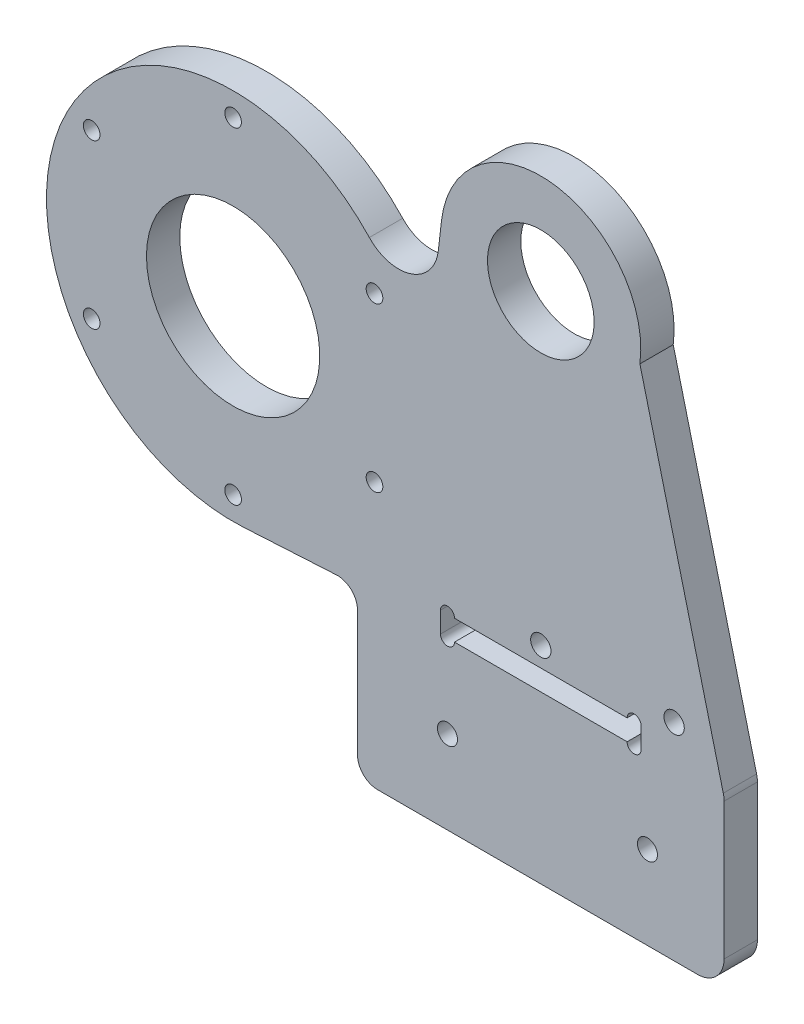
ISO-10303-21;
HEADER;
FILE_DESCRIPTION(('STEP AP214'),'2;1');
FILE_NAME('part.step','',(''),(''),'','','');
FILE_SCHEMA(('AUTOMOTIVE_DESIGN { 1 0 10303 214 1 1 1 1 }'));
ENDSEC;
DATA;
#1=APPLICATION_CONTEXT('core data for automotive mechanical design processes');
#2=APPLICATION_PROTOCOL_DEFINITION('international standard','automotive_design',2000,#1);
#3=PRODUCT_CONTEXT('',#1,'mechanical');
#4=PRODUCT('Part','Part','',(#3));
#5=PRODUCT_RELATED_PRODUCT_CATEGORY('part','',(#4));
#6=PRODUCT_DEFINITION_FORMATION('','',#4);
#7=PRODUCT_DEFINITION_CONTEXT('part definition',#1,'design');
#8=PRODUCT_DEFINITION('design','',#6,#7);
#9=PRODUCT_DEFINITION_SHAPE('','',#8);
#10=(LENGTH_UNIT() NAMED_UNIT(*) SI_UNIT(.MILLI.,.METRE.));
#11=(NAMED_UNIT(*) PLANE_ANGLE_UNIT() SI_UNIT($,.RADIAN.));
#12=(NAMED_UNIT(*) SI_UNIT($,.STERADIAN.) SOLID_ANGLE_UNIT());
#13=UNCERTAINTY_MEASURE_WITH_UNIT(LENGTH_MEASURE(1.E-05),#10,'distance_accuracy_value','');
#14=(GEOMETRIC_REPRESENTATION_CONTEXT(3) GLOBAL_UNCERTAINTY_ASSIGNED_CONTEXT((#13)) GLOBAL_UNIT_ASSIGNED_CONTEXT((#10,
#11,#12)) REPRESENTATION_CONTEXT('',''));
#15=CARTESIAN_POINT('',(0.,0.,0.));
#16=DIRECTION('',(0.,0.,1.));
#17=DIRECTION('',(1.,0.,0.));
#18=AXIS2_PLACEMENT_3D('',#15,#16,#17);
#19=CARTESIAN_POINT('',(-20.,-12.5,5.));
#20=DIRECTION('',(1.,0.,0.));
#21=DIRECTION('',(0.,1.,0.));
#22=AXIS2_PLACEMENT_3D('',#19,#20,#21);
#23=PLANE('',#22);
#24=DIRECTION('',(0.,-1.,0.));
#25=VECTOR('',#24,1.);
#26=CARTESIAN_POINT('',(-20.,-12.5,0.));
#27=LINE('',#26,#25);
#28=CARTESIAN_POINT('',(-20.,9.32755831972879,0.));
#29=VERTEX_POINT('',#28);
#30=CARTESIAN_POINT('',(-20.,-9.5,0.));
#31=VERTEX_POINT('',#30);
#32=EDGE_CURVE('E327',#29,#31,#27,.T.);
#33=ORIENTED_EDGE('',*,*,#32,.T.);
#34=DIRECTION('',(0.,0.,-1.));
#35=VECTOR('',#34,1.);
#36=CARTESIAN_POINT('',(-20.,-9.5,5.));
#37=LINE('',#36,#35);
#38=CARTESIAN_POINT('',(-20.,-9.5,5.));
#39=VERTEX_POINT('',#38);
#40=EDGE_CURVE('E347',#31,#39,#37,.F.);
#41=ORIENTED_EDGE('',*,*,#40,.T.);
#42=DIRECTION('',(0.,-1.,0.));
#43=VECTOR('',#42,1.);
#44=CARTESIAN_POINT('',(-20.,-12.5,5.));
#45=LINE('',#44,#43);
#46=CARTESIAN_POINT('',(-20.,9.32755831972879,5.));
#47=VERTEX_POINT('',#46);
#48=EDGE_CURVE('E328',#47,#39,#45,.T.);
#49=ORIENTED_EDGE('',*,*,#48,.F.);
#50=DIRECTION('',(0.,0.,-1.));
#51=VECTOR('',#50,1.);
#52=CARTESIAN_POINT('',(-20.,9.32755831972879,5.));
#53=LINE('',#52,#51);
#54=EDGE_CURVE('E344',#47,#29,#53,.T.);
#55=ORIENTED_EDGE('',*,*,#54,.T.);
#56=EDGE_LOOP('',(#33,#41,#49,#55));
#57=FACE_BOUND('',#56,.T.);
#58=ADVANCED_FACE('F36',(#57),#23,.F.);
#59=CARTESIAN_POINT('',(-20.,-12.5,5.));
#60=DIRECTION('',(0.,1.,0.));
#61=DIRECTION('',(0.,0.,1.));
#62=AXIS2_PLACEMENT_3D('',#59,#60,#61);
#63=PLANE('',#62);
#64=DIRECTION('',(1.,0.,0.));
#65=VECTOR('',#64,1.);
#66=CARTESIAN_POINT('',(-20.,-12.5,0.));
#67=LINE('',#66,#65);
#68=CARTESIAN_POINT('',(-17.,-12.5,0.));
#69=VERTEX_POINT('',#68);
#70=CARTESIAN_POINT('',(31.,-12.5,0.));
#71=VERTEX_POINT('',#70);
#72=EDGE_CURVE('E332',#69,#71,#67,.T.);
#73=ORIENTED_EDGE('',*,*,#72,.T.);
#74=DIRECTION('',(0.,0.,-1.));
#75=VECTOR('',#74,1.);
#76=CARTESIAN_POINT('',(31.,-12.5,5.));
#77=LINE('',#76,#75);
#78=CARTESIAN_POINT('',(31.,-12.5,5.));
#79=VERTEX_POINT('',#78);
#80=EDGE_CURVE('E373',#71,#79,#77,.F.);
#81=ORIENTED_EDGE('',*,*,#80,.T.);
#82=DIRECTION('',(1.,0.,0.));
#83=VECTOR('',#82,1.);
#84=CARTESIAN_POINT('',(-20.,-12.5,5.));
#85=LINE('',#84,#83);
#86=CARTESIAN_POINT('',(-17.,-12.5,5.));
#87=VERTEX_POINT('',#86);
#88=EDGE_CURVE('E331',#87,#79,#85,.T.);
#89=ORIENTED_EDGE('',*,*,#88,.F.);
#90=DIRECTION('',(0.,0.,-1.));
#91=VECTOR('',#90,1.);
#92=CARTESIAN_POINT('',(-17.,-12.5,5.));
#93=LINE('',#92,#91);
#94=EDGE_CURVE('E335',#87,#69,#93,.T.);
#95=ORIENTED_EDGE('',*,*,#94,.T.);
#96=EDGE_LOOP('',(#73,#81,#89,#95));
#97=FACE_BOUND('',#96,.T.);
#98=ADVANCED_FACE('F406',(#97),#63,.F.);
#99=CARTESIAN_POINT('',(0.,0.,5.));
#100=DIRECTION('',(0.,0.,-1.));
#101=DIRECTION('',(-1.,0.,0.));
#102=AXIS2_PLACEMENT_3D('',#99,#100,#101);
#103=PLANE('',#102);
#104=CARTESIAN_POINT('',(27.5,18.5,5.));
#105=DIRECTION('',(0.,0.,-1.));
#106=DIRECTION('',(-1.,0.,0.));
#107=AXIS2_PLACEMENT_3D('',#104,#105,#106);
#108=CIRCLE('',#107,1.525);
#109=CARTESIAN_POINT('',(25.975,18.5,5.));
#110=VERTEX_POINT('',#109);
#111=EDGE_CURVE('E563',#110,#110,#108,.T.);
#112=ORIENTED_EDGE('',*,*,#111,.T.);
#113=EDGE_LOOP('',(#112));
#114=FACE_BOUND('',#113,.T.);
#115=CARTESIAN_POINT('',(7.49999999999995,18.5,5.));
#116=DIRECTION('',(0.,0.,-1.));
#117=DIRECTION('',(-1.,0.,0.));
#118=AXIS2_PLACEMENT_3D('',#115,#116,#117);
#119=CIRCLE('',#118,1.525);
#120=CARTESIAN_POINT('',(5.97499999999995,18.5,5.));
#121=VERTEX_POINT('',#120);
#122=EDGE_CURVE('E567',#121,#121,#119,.T.);
#123=ORIENTED_EDGE('',*,*,#122,.T.);
#124=EDGE_LOOP('',(#123));
#125=FACE_BOUND('',#124,.T.);
#126=CARTESIAN_POINT('',(23.5,0.,5.));
#127=DIRECTION('',(0.,0.,-1.));
#128=DIRECTION('',(-1.,0.,0.));
#129=AXIS2_PLACEMENT_3D('',#126,#127,#128);
#130=CIRCLE('',#129,1.5);
#131=CARTESIAN_POINT('',(22.,0.,5.));
#132=VERTEX_POINT('',#131);
#133=EDGE_CURVE('E554',#132,#132,#130,.T.);
#134=ORIENTED_EDGE('',*,*,#133,.T.);
#135=EDGE_LOOP('',(#134));
#136=FACE_BOUND('',#135,.T.);
#137=CARTESIAN_POINT('',(-6.50000000000005,0.,5.));
#138=DIRECTION('',(0.,0.,-1.));
#139=DIRECTION('',(-1.,0.,0.));
#140=AXIS2_PLACEMENT_3D('',#137,#138,#139);
#141=CIRCLE('',#140,1.5);
#142=CARTESIAN_POINT('',(-8.00000000000005,0.,5.));
#143=VERTEX_POINT('',#142);
#144=EDGE_CURVE('E557',#143,#143,#141,.T.);
#145=ORIENTED_EDGE('',*,*,#144,.T.);
#146=EDGE_LOOP('',(#145));
#147=FACE_BOUND('',#146,.T.);
#148=DIRECTION('',(-1.,0.,0.));
#149=VECTOR('',#148,1.);
#150=CARTESIAN_POINT('',(22.55,15.5500000000003,5.));
#151=LINE('',#150,#149);
#152=CARTESIAN_POINT('',(20.45,15.5500000000003,5.));
#153=VERTEX_POINT('',#152);
#154=CARTESIAN_POINT('',(-5.45000000000005,15.5500000000003,5.));
#155=VERTEX_POINT('',#154);
#156=EDGE_CURVE('E193',#153,#155,#151,.T.);
#157=ORIENTED_EDGE('',*,*,#156,.F.);
#158=CARTESIAN_POINT('',(21.5,15.5500000000003,5.));
#159=DIRECTION('',(0.,0.,1.));
#160=DIRECTION('',(1.,0.,0.));
#161=AXIS2_PLACEMENT_3D('',#158,#159,#160);
#162=CIRCLE('',#161,1.04999999999999);
#163=CARTESIAN_POINT('',(22.5499999999999,15.5500000000003,5.));
#164=VERTEX_POINT('',#163);
#165=EDGE_CURVE('E533',#164,#153,#162,.T.);
#166=ORIENTED_EDGE('',*,*,#165,.F.);
#167=DIRECTION('',(0.,1.,0.));
#168=VECTOR('',#167,1.);
#169=CARTESIAN_POINT('',(22.55,12.4500000000003,5.));
#170=LINE('',#169,#168);
#171=CARTESIAN_POINT('',(22.55,12.4500000000003,5.));
#172=VERTEX_POINT('',#171);
#173=EDGE_CURVE('E201',#172,#164,#170,.T.);
#174=ORIENTED_EDGE('',*,*,#173,.F.);
#175=CARTESIAN_POINT('',(21.5,12.4500000000003,5.));
#176=DIRECTION('',(0.,0.,1.));
#177=DIRECTION('',(1.,0.,0.));
#178=AXIS2_PLACEMENT_3D('',#175,#176,#177);
#179=CIRCLE('',#178,1.05);
#180=CARTESIAN_POINT('',(20.45,12.4500000000003,5.));
#181=VERTEX_POINT('',#180);
#182=EDGE_CURVE('E553',#181,#172,#179,.T.);
#183=ORIENTED_EDGE('',*,*,#182,.F.);
#184=DIRECTION('',(1.,0.,0.));
#185=VECTOR('',#184,1.);
#186=CARTESIAN_POINT('',(-7.55000000000005,12.4500000000003,5.));
#187=LINE('',#186,#185);
#188=CARTESIAN_POINT('',(-5.45000000000005,12.4500000000003,5.));
#189=VERTEX_POINT('',#188);
#190=EDGE_CURVE('E207',#189,#181,#187,.T.);
#191=ORIENTED_EDGE('',*,*,#190,.F.);
#192=CARTESIAN_POINT('',(-6.50000000000005,12.4500000000003,5.));
#193=DIRECTION('',(0.,0.,1.));
#194=DIRECTION('',(1.,0.,0.));
#195=AXIS2_PLACEMENT_3D('',#192,#193,#194);
#196=CIRCLE('',#195,1.05);
#197=CARTESIAN_POINT('',(-7.55000000000004,12.4500000000003,5.));
#198=VERTEX_POINT('',#197);
#199=EDGE_CURVE('E538',#198,#189,#196,.T.);
#200=ORIENTED_EDGE('',*,*,#199,.F.);
#201=DIRECTION('',(0.,-1.,0.));
#202=VECTOR('',#201,1.);
#203=CARTESIAN_POINT('',(-7.55000000000005,15.5500000000003,5.));
#204=LINE('',#203,#202);
#205=CARTESIAN_POINT('',(-7.55000000000005,15.5500000000003,5.));
#206=VERTEX_POINT('',#205);
#207=EDGE_CURVE('E196',#206,#198,#204,.T.);
#208=ORIENTED_EDGE('',*,*,#207,.F.);
#209=CARTESIAN_POINT('',(-6.50000000000005,15.5500000000003,5.));
#210=DIRECTION('',(0.,0.,1.));
#211=DIRECTION('',(1.,0.,0.));
#212=AXIS2_PLACEMENT_3D('',#209,#210,#211);
#213=CIRCLE('',#212,1.05);
#214=EDGE_CURVE('E51',#155,#206,#213,.T.);
#215=ORIENTED_EDGE('',*,*,#214,.F.);
#216=EDGE_LOOP('',(#157,#166,#174,#183,#191,#200,#208,#215));
#217=FACE_BOUND('',#216,.T.);
#218=CARTESIAN_POINT('',(-38.6654632815485,39.5,5.));
#219=DIRECTION('',(0.,0.,-1.));
#220=DIRECTION('',(-1.,0.,0.));
#221=AXIS2_PLACEMENT_3D('',#218,#219,#220);
#222=CIRCLE('',#221,13.);
#223=CARTESIAN_POINT('',(-51.6654632815485,39.5,5.));
#224=VERTEX_POINT('',#223);
#225=EDGE_CURVE('E270',#224,#224,#222,.T.);
#226=ORIENTED_EDGE('',*,*,#225,.T.);
#227=EDGE_LOOP('',(#226));
#228=FACE_BOUND('',#227,.T.);
#229=CARTESIAN_POINT('',(-38.6654632815485,64.,5.));
#230=DIRECTION('',(0.,0.,-1.));
#231=DIRECTION('',(-1.,0.,0.));
#232=AXIS2_PLACEMENT_3D('',#229,#230,#231);
#233=CIRCLE('',#232,1.25);
#234=CARTESIAN_POINT('',(-39.9154632815485,64.,5.));
#235=VERTEX_POINT('',#234);
#236=EDGE_CURVE('E306',#235,#235,#233,.T.);
#237=ORIENTED_EDGE('',*,*,#236,.T.);
#238=EDGE_LOOP('',(#237));
#239=FACE_BOUND('',#238,.T.);
#240=CARTESIAN_POINT('',(-17.4478408888297,51.75,5.));
#241=DIRECTION('',(0.,0.,-1.));
#242=DIRECTION('',(-1.,0.,0.));
#243=AXIS2_PLACEMENT_3D('',#240,#241,#242);
#244=CIRCLE('',#243,1.25);
#245=CARTESIAN_POINT('',(-18.6978408888297,51.75,5.));
#246=VERTEX_POINT('',#245);
#247=EDGE_CURVE('E303',#246,#246,#244,.T.);
#248=ORIENTED_EDGE('',*,*,#247,.T.);
#249=EDGE_LOOP('',(#248));
#250=FACE_BOUND('',#249,.T.);
#251=CARTESIAN_POINT('',(-17.4478408888297,27.25,5.));
#252=DIRECTION('',(0.,0.,-1.));
#253=DIRECTION('',(-1.,0.,0.));
#254=AXIS2_PLACEMENT_3D('',#251,#252,#253);
#255=CIRCLE('',#254,1.25);
#256=CARTESIAN_POINT('',(-18.6978408888297,27.25,5.));
#257=VERTEX_POINT('',#256);
#258=EDGE_CURVE('E300',#257,#257,#255,.T.);
#259=ORIENTED_EDGE('',*,*,#258,.T.);
#260=EDGE_LOOP('',(#259));
#261=FACE_BOUND('',#260,.T.);
#262=CARTESIAN_POINT('',(-38.6654632815485,15.,5.));
#263=DIRECTION('',(0.,0.,-1.));
#264=DIRECTION('',(-1.,0.,0.));
#265=AXIS2_PLACEMENT_3D('',#262,#263,#264);
#266=CIRCLE('',#265,1.25000000000001);
#267=CARTESIAN_POINT('',(-39.9154632815485,15.,5.));
#268=VERTEX_POINT('',#267);
#269=EDGE_CURVE('E297',#268,#268,#266,.T.);
#270=ORIENTED_EDGE('',*,*,#269,.T.);
#271=EDGE_LOOP('',(#270));
#272=FACE_BOUND('',#271,.T.);
#273=CARTESIAN_POINT('',(-59.8830856742672,27.25,5.));
#274=DIRECTION('',(0.,0.,-1.));
#275=DIRECTION('',(-1.,0.,0.));
#276=AXIS2_PLACEMENT_3D('',#273,#274,#275);
#277=CIRCLE('',#276,1.24999999999999);
#278=CARTESIAN_POINT('',(-61.1330856742672,27.25,5.));
#279=VERTEX_POINT('',#278);
#280=EDGE_CURVE('E294',#279,#279,#277,.T.);
#281=ORIENTED_EDGE('',*,*,#280,.T.);
#282=EDGE_LOOP('',(#281));
#283=FACE_BOUND('',#282,.T.);
#284=CARTESIAN_POINT('',(-59.8830856742672,51.75,5.));
#285=DIRECTION('',(0.,0.,-1.));
#286=DIRECTION('',(-1.,0.,0.));
#287=AXIS2_PLACEMENT_3D('',#284,#285,#286);
#288=CIRCLE('',#287,1.25);
#289=CARTESIAN_POINT('',(-61.1330856742672,51.75,5.));
#290=VERTEX_POINT('',#289);
#291=EDGE_CURVE('E277',#290,#290,#288,.T.);
#292=ORIENTED_EDGE('',*,*,#291,.T.);
#293=EDGE_LOOP('',(#292));
#294=FACE_BOUND('',#293,.T.);
#295=CARTESIAN_POINT('',(7.49999999999998,64.5,5.));
#296=DIRECTION('',(0.,0.,-1.));
#297=DIRECTION('',(-1.,0.,0.));
#298=AXIS2_PLACEMENT_3D('',#295,#296,#297);
#299=CIRCLE('',#298,15.);
#300=CARTESIAN_POINT('',(22.3667449619937,62.5050327734435,5.));
#301=VERTEX_POINT('',#300);
#302=CARTESIAN_POINT('',(-7.40138609631586,66.2171757069458,5.));
#303=VERTEX_POINT('',#302);
#304=EDGE_CURVE('E253',#301,#303,#299,.F.);
#305=ORIENTED_EDGE('',*,*,#304,.T.);
#306=DIRECTION('',(-0.114478380463056,-0.993425739754389,0.));
#307=VECTOR('',#306,1.);
#308=CARTESIAN_POINT('',(-14.8349879951987,1.70952425724252,5.));
#309=LINE('',#308,#307);
#310=CARTESIAN_POINT('',(-7.8819237710066,62.0471438369233,5.));
#311=VERTEX_POINT('',#310);
#312=EDGE_CURVE('E241',#303,#311,#309,.T.);
#313=ORIENTED_EDGE('',*,*,#312,.T.);
#314=CARTESIAN_POINT('',(-13.842478209533,62.7340141197016,5.));
#315=DIRECTION('',(0.,0.,-1.));
#316=DIRECTION('',(-1.,0.,0.));
#317=AXIS2_PLACEMENT_3D('',#314,#315,#316);
#318=CIRCLE('',#317,6.00000000000001);
#319=CARTESIAN_POINT('',(-18.2230049869475,58.6338939809307,5.));
#320=VERTEX_POINT('',#319);
#321=EDGE_CURVE('E249',#311,#320,#318,.T.);
#322=ORIENTED_EDGE('',*,*,#321,.T.);
#323=CARTESIAN_POINT('',(-38.6654632815485,39.5,5.));
#324=DIRECTION('',(0.,0.,-1.));
#325=DIRECTION('',(-1.,0.,0.));
#326=AXIS2_PLACEMENT_3D('',#323,#324,#325);
#327=CIRCLE('',#326,28.);
#328=CARTESIAN_POINT('',(-37.1021916568264,11.5436736707532,5.));
#329=VERTEX_POINT('',#328);
#330=EDGE_CURVE('E310',#320,#329,#327,.F.);
#331=ORIENTED_EDGE('',*,*,#330,.T.);
#332=DIRECTION('',(0.998440226044529,0.0558311294543586,0.));
#333=VECTOR('',#332,1.);
#334=CARTESIAN_POINT('',(-37.1021916568264,11.5436736707532,5.));
#335=LINE('',#334,#333);
#336=CARTESIAN_POINT('',(-23.1674933883631,12.3228789978624,5.));
#337=VERTEX_POINT('',#336);
#338=EDGE_CURVE('E312',#329,#337,#335,.T.);
#339=ORIENTED_EDGE('',*,*,#338,.T.);
#340=CARTESIAN_POINT('',(-23.,9.32755831972879,5.));
#341=DIRECTION('',(0.,0.,-1.));
#342=DIRECTION('',(-1.,0.,0.));
#343=AXIS2_PLACEMENT_3D('',#340,#341,#342);
#344=CIRCLE('',#343,3.);
#345=EDGE_CURVE('E355',#337,#47,#344,.T.);
#346=ORIENTED_EDGE('',*,*,#345,.T.);
#347=ORIENTED_EDGE('',*,*,#48,.T.);
#348=CARTESIAN_POINT('',(-17.,-9.5,5.));
#349=DIRECTION('',(0.,0.,-1.));
#350=DIRECTION('',(-1.,0.,0.));
#351=AXIS2_PLACEMENT_3D('',#348,#349,#350);
#352=CIRCLE('',#351,3.);
#353=EDGE_CURVE('E349',#39,#87,#352,.F.);
#354=ORIENTED_EDGE('',*,*,#353,.T.);
#355=ORIENTED_EDGE('',*,*,#88,.T.);
#356=CARTESIAN_POINT('',(31.,-8.5,5.));
#357=DIRECTION('',(0.,0.,-1.));
#358=DIRECTION('',(-1.,0.,0.));
#359=AXIS2_PLACEMENT_3D('',#356,#357,#358);
#360=CIRCLE('',#359,4.);
#361=CARTESIAN_POINT('',(35.,-8.5,5.));
#362=VERTEX_POINT('',#361);
#363=EDGE_CURVE('E369',#79,#362,#360,.F.);
#364=ORIENTED_EDGE('',*,*,#363,.T.);
#365=DIRECTION('',(0.,1.,0.));
#366=VECTOR('',#365,1.);
#367=CARTESIAN_POINT('',(35.,-12.5,5.));
#368=LINE('',#367,#366);
#369=CARTESIAN_POINT('',(35.,12.0025357708576,5.));
#370=VERTEX_POINT('',#369);
#371=EDGE_CURVE('E257',#362,#370,#368,.T.);
#372=ORIENTED_EDGE('',*,*,#371,.T.);
#373=CARTESIAN_POINT('',(31.,12.0025357708576,5.));
#374=DIRECTION('',(0.,0.,-1.));
#375=DIRECTION('',(-1.,0.,0.));
#376=AXIS2_PLACEMENT_3D('',#373,#374,#375);
#377=CIRCLE('',#376,4.);
#378=CARTESIAN_POINT('',(34.8781493245486,12.9823101410589,5.));
#379=VERTEX_POINT('',#378);
#380=EDGE_CURVE('E371',#370,#379,#377,.F.);
#381=ORIENTED_EDGE('',*,*,#380,.T.);
#382=DIRECTION('',(-0.244943592550317,0.969537331137149,0.));
#383=VECTOR('',#382,1.);
#384=CARTESIAN_POINT('',(35.,12.5,5.));
#385=LINE('',#384,#383);
#386=EDGE_CURVE('E260',#379,#301,#385,.T.);
#387=ORIENTED_EDGE('',*,*,#386,.T.);
#388=EDGE_LOOP('',(#305,#313,#322,#331,#339,#346,#347,#354,#355,#364,#372,#381,#387));
#389=FACE_BOUND('',#388,.T.);
#390=CARTESIAN_POINT('',(7.49999999999998,64.5,5.));
#391=DIRECTION('',(0.,0.,-1.));
#392=DIRECTION('',(-1.,0.,0.));
#393=AXIS2_PLACEMENT_3D('',#390,#391,#392);
#394=CIRCLE('',#393,8.);
#395=CARTESIAN_POINT('',(-0.500000000000017,64.5,5.));
#396=VERTEX_POINT('',#395);
#397=EDGE_CURVE('E324',#396,#396,#394,.T.);
#398=ORIENTED_EDGE('',*,*,#397,.T.);
#399=EDGE_LOOP('',(#398));
#400=FACE_BOUND('',#399,.T.);
#401=ADVANCED_FACE('F190',(#114,#125,#136,#147,#217,#228,#239,#250,#261,#272,#283,#294,#389,
#400),#103,.F.);
#402=CARTESIAN_POINT('',(0.,0.,0.));
#403=DIRECTION('',(0.,0.,-1.));
#404=DIRECTION('',(-1.,0.,0.));
#405=AXIS2_PLACEMENT_3D('',#402,#403,#404);
#406=PLANE('',#405);
#407=CARTESIAN_POINT('',(27.5,18.5,0.));
#408=DIRECTION('',(0.,0.,-1.));
#409=DIRECTION('',(-1.,0.,0.));
#410=AXIS2_PLACEMENT_3D('',#407,#408,#409);
#411=CIRCLE('',#410,1.525);
#412=CARTESIAN_POINT('',(25.975,18.5,0.));
#413=VERTEX_POINT('',#412);
#414=EDGE_CURVE('E515',#413,#413,#411,.T.);
#415=ORIENTED_EDGE('',*,*,#414,.F.);
#416=EDGE_LOOP('',(#415));
#417=FACE_BOUND('',#416,.T.);
#418=CARTESIAN_POINT('',(7.49999999999995,18.5,0.));
#419=DIRECTION('',(0.,0.,-1.));
#420=DIRECTION('',(-1.,0.,0.));
#421=AXIS2_PLACEMENT_3D('',#418,#419,#420);
#422=CIRCLE('',#421,1.525);
#423=CARTESIAN_POINT('',(5.97499999999995,18.5,0.));
#424=VERTEX_POINT('',#423);
#425=EDGE_CURVE('E519',#424,#424,#422,.T.);
#426=ORIENTED_EDGE('',*,*,#425,.F.);
#427=EDGE_LOOP('',(#426));
#428=FACE_BOUND('',#427,.T.);
#429=CARTESIAN_POINT('',(23.5,0.,0.));
#430=DIRECTION('',(0.,0.,-1.));
#431=DIRECTION('',(-1.,0.,0.));
#432=AXIS2_PLACEMENT_3D('',#429,#430,#431);
#433=CIRCLE('',#432,1.5);
#434=CARTESIAN_POINT('',(22.,0.,0.));
#435=VERTEX_POINT('',#434);
#436=EDGE_CURVE('E523',#435,#435,#433,.T.);
#437=ORIENTED_EDGE('',*,*,#436,.F.);
#438=EDGE_LOOP('',(#437));
#439=FACE_BOUND('',#438,.T.);
#440=CARTESIAN_POINT('',(-6.50000000000005,0.,0.));
#441=DIRECTION('',(0.,0.,-1.));
#442=DIRECTION('',(-1.,0.,0.));
#443=AXIS2_PLACEMENT_3D('',#440,#441,#442);
#444=CIRCLE('',#443,1.5);
#445=CARTESIAN_POINT('',(-8.00000000000005,0.,0.));
#446=VERTEX_POINT('',#445);
#447=EDGE_CURVE('E527',#446,#446,#444,.T.);
#448=ORIENTED_EDGE('',*,*,#447,.F.);
#449=EDGE_LOOP('',(#448));
#450=FACE_BOUND('',#449,.T.);
#451=CARTESIAN_POINT('',(21.5,15.5500000000003,0.));
#452=DIRECTION('',(0.,0.,-1.));
#453=DIRECTION('',(-1.,0.,0.));
#454=AXIS2_PLACEMENT_3D('',#451,#452,#453);
#455=CIRCLE('',#454,1.04999999999999);
#456=CARTESIAN_POINT('',(22.55,15.5500000000003,0.));
#457=VERTEX_POINT('',#456);
#458=CARTESIAN_POINT('',(20.45,15.5500000000003,0.));
#459=VERTEX_POINT('',#458);
#460=EDGE_CURVE('E197',#457,#459,#455,.F.);
#461=ORIENTED_EDGE('',*,*,#460,.T.);
#462=DIRECTION('',(-1.,0.,0.));
#463=VECTOR('',#462,1.);
#464=CARTESIAN_POINT('',(22.55,15.5500000000003,0.));
#465=LINE('',#464,#463);
#466=CARTESIAN_POINT('',(-5.45000000000005,15.5500000000003,0.));
#467=VERTEX_POINT('',#466);
#468=EDGE_CURVE('E221',#459,#467,#465,.T.);
#469=ORIENTED_EDGE('',*,*,#468,.T.);
#470=CARTESIAN_POINT('',(-6.50000000000005,15.5500000000003,0.));
#471=DIRECTION('',(0.,0.,-1.));
#472=DIRECTION('',(-1.,0.,0.));
#473=AXIS2_PLACEMENT_3D('',#470,#471,#472);
#474=CIRCLE('',#473,1.05);
#475=CARTESIAN_POINT('',(-7.55000000000004,15.5500000000003,0.));
#476=VERTEX_POINT('',#475);
#477=EDGE_CURVE('E180',#467,#476,#474,.F.);
#478=ORIENTED_EDGE('',*,*,#477,.T.);
#479=DIRECTION('',(0.,-1.,0.));
#480=VECTOR('',#479,1.);
#481=CARTESIAN_POINT('',(-7.55000000000005,15.5500000000003,0.));
#482=LINE('',#481,#480);
#483=CARTESIAN_POINT('',(-7.55000000000005,12.4500000000003,0.));
#484=VERTEX_POINT('',#483);
#485=EDGE_CURVE('E216',#476,#484,#482,.T.);
#486=ORIENTED_EDGE('',*,*,#485,.T.);
#487=CARTESIAN_POINT('',(-6.50000000000005,12.4500000000003,0.));
#488=DIRECTION('',(0.,0.,-1.));
#489=DIRECTION('',(-1.,0.,0.));
#490=AXIS2_PLACEMENT_3D('',#487,#488,#489);
#491=CIRCLE('',#490,1.05);
#492=CARTESIAN_POINT('',(-5.45000000000005,12.4500000000003,0.));
#493=VERTEX_POINT('',#492);
#494=EDGE_CURVE('E59',#484,#493,#491,.F.);
#495=ORIENTED_EDGE('',*,*,#494,.T.);
#496=DIRECTION('',(1.,0.,0.));
#497=VECTOR('',#496,1.);
#498=CARTESIAN_POINT('',(-7.55000000000005,12.4500000000003,0.));
#499=LINE('',#498,#497);
#500=CARTESIAN_POINT('',(20.45,12.4500000000003,0.));
#501=VERTEX_POINT('',#500);
#502=EDGE_CURVE('E200',#493,#501,#499,.T.);
#503=ORIENTED_EDGE('',*,*,#502,.T.);
#504=CARTESIAN_POINT('',(21.5,12.4500000000003,0.));
#505=DIRECTION('',(0.,0.,-1.));
#506=DIRECTION('',(-1.,0.,0.));
#507=AXIS2_PLACEMENT_3D('',#504,#505,#506);
#508=CIRCLE('',#507,1.05);
#509=CARTESIAN_POINT('',(22.5499999999999,12.4500000000003,0.));
#510=VERTEX_POINT('',#509);
#511=EDGE_CURVE('E540',#501,#510,#508,.F.);
#512=ORIENTED_EDGE('',*,*,#511,.T.);
#513=DIRECTION('',(0.,1.,0.));
#514=VECTOR('',#513,1.);
#515=CARTESIAN_POINT('',(22.55,12.4500000000003,0.));
#516=LINE('',#515,#514);
#517=EDGE_CURVE('E224',#510,#457,#516,.T.);
#518=ORIENTED_EDGE('',*,*,#517,.T.);
#519=EDGE_LOOP('',(#461,#469,#478,#486,#495,#503,#512,#518));
#520=FACE_BOUND('',#519,.T.);
#521=DIRECTION('',(-0.114478380463056,-0.993425739754389,0.));
#522=VECTOR('',#521,1.);
#523=CARTESIAN_POINT('',(-7.40138609631586,66.2171757069458,0.));
#524=LINE('',#523,#522);
#525=CARTESIAN_POINT('',(-7.40138609631586,66.2171757069458,0.));
#526=VERTEX_POINT('',#525);
#527=CARTESIAN_POINT('',(-7.8819237710066,62.0471438369233,0.));
#528=VERTEX_POINT('',#527);
#529=EDGE_CURVE('E235',#526,#528,#524,.T.);
#530=ORIENTED_EDGE('',*,*,#529,.F.);
#531=CARTESIAN_POINT('',(7.49999999999998,64.5,0.));
#532=DIRECTION('',(0.,0.,-1.));
#533=DIRECTION('',(-1.,0.,0.));
#534=AXIS2_PLACEMENT_3D('',#531,#532,#533);
#535=CIRCLE('',#534,15.);
#536=CARTESIAN_POINT('',(22.3667449619937,62.5050327734435,0.));
#537=VERTEX_POINT('',#536);
#538=EDGE_CURVE('E252',#526,#537,#535,.T.);
#539=ORIENTED_EDGE('',*,*,#538,.T.);
#540=DIRECTION('',(0.244943592550317,-0.969537331137148,0.));
#541=VECTOR('',#540,1.);
#542=CARTESIAN_POINT('',(35.,12.5,0.));
#543=LINE('',#542,#541);
#544=CARTESIAN_POINT('',(34.8781493245486,12.9823101410589,0.));
#545=VERTEX_POINT('',#544);
#546=EDGE_CURVE('E255',#537,#545,#543,.T.);
#547=ORIENTED_EDGE('',*,*,#546,.T.);
#548=CARTESIAN_POINT('',(31.,12.0025357708576,0.));
#549=DIRECTION('',(0.,0.,-1.));
#550=DIRECTION('',(-1.,0.,0.));
#551=AXIS2_PLACEMENT_3D('',#548,#549,#550);
#552=CIRCLE('',#551,4.);
#553=CARTESIAN_POINT('',(35.,12.0025357708576,0.));
#554=VERTEX_POINT('',#553);
#555=EDGE_CURVE('E362',#545,#554,#552,.T.);
#556=ORIENTED_EDGE('',*,*,#555,.T.);
#557=DIRECTION('',(0.,-1.,0.));
#558=VECTOR('',#557,1.);
#559=CARTESIAN_POINT('',(35.,-12.5,0.));
#560=LINE('',#559,#558);
#561=CARTESIAN_POINT('',(35.,-8.5,0.));
#562=VERTEX_POINT('',#561);
#563=EDGE_CURVE('E261',#554,#562,#560,.T.);
#564=ORIENTED_EDGE('',*,*,#563,.T.);
#565=CARTESIAN_POINT('',(31.,-8.5,0.));
#566=DIRECTION('',(0.,0.,-1.));
#567=DIRECTION('',(-1.,0.,0.));
#568=AXIS2_PLACEMENT_3D('',#565,#566,#567);
#569=CIRCLE('',#568,4.);
#570=EDGE_CURVE('E360',#562,#71,#569,.T.);
#571=ORIENTED_EDGE('',*,*,#570,.T.);
#572=ORIENTED_EDGE('',*,*,#72,.F.);
#573=CARTESIAN_POINT('',(-17.,-9.5,0.));
#574=DIRECTION('',(0.,0.,-1.));
#575=DIRECTION('',(-1.,0.,0.));
#576=AXIS2_PLACEMENT_3D('',#573,#574,#575);
#577=CIRCLE('',#576,3.);
#578=EDGE_CURVE('E342',#69,#31,#577,.T.);
#579=ORIENTED_EDGE('',*,*,#578,.T.);
#580=ORIENTED_EDGE('',*,*,#32,.F.);
#581=CARTESIAN_POINT('',(-23.,9.32755831972879,0.));
#582=DIRECTION('',(0.,0.,-1.));
#583=DIRECTION('',(-1.,0.,0.));
#584=AXIS2_PLACEMENT_3D('',#581,#582,#583);
#585=CIRCLE('',#584,3.);
#586=CARTESIAN_POINT('',(-23.1674933883631,12.3228789978624,0.));
#587=VERTEX_POINT('',#586);
#588=EDGE_CURVE('E353',#29,#587,#585,.F.);
#589=ORIENTED_EDGE('',*,*,#588,.T.);
#590=DIRECTION('',(-0.998440226044529,-0.0558311294543586,0.));
#591=VECTOR('',#590,1.);
#592=CARTESIAN_POINT('',(-37.1021916568264,11.5436736707532,0.));
#593=LINE('',#592,#591);
#594=CARTESIAN_POINT('',(-37.1021916568264,11.5436736707532,0.));
#595=VERTEX_POINT('',#594);
#596=EDGE_CURVE('E309',#587,#595,#593,.T.);
#597=ORIENTED_EDGE('',*,*,#596,.T.);
#598=CARTESIAN_POINT('',(-38.6654632815485,39.5,0.));
#599=DIRECTION('',(0.,0.,-1.));
#600=DIRECTION('',(-1.,0.,0.));
#601=AXIS2_PLACEMENT_3D('',#598,#599,#600);
#602=CIRCLE('',#601,28.);
#603=CARTESIAN_POINT('',(-18.2230049869475,58.6338939809307,0.));
#604=VERTEX_POINT('',#603);
#605=EDGE_CURVE('E315',#595,#604,#602,.T.);
#606=ORIENTED_EDGE('',*,*,#605,.T.);
#607=CARTESIAN_POINT('',(-13.842478209533,62.7340141197016,0.));
#608=DIRECTION('',(0.,0.,-1.));
#609=DIRECTION('',(-1.,0.,0.));
#610=AXIS2_PLACEMENT_3D('',#607,#608,#609);
#611=CIRCLE('',#610,6.00000000000001);
#612=EDGE_CURVE('E232',#528,#604,#611,.T.);
#613=ORIENTED_EDGE('',*,*,#612,.F.);
#614=EDGE_LOOP('',(#530,#539,#547,#556,#564,#571,#572,#579,#580,#589,#597,#606,#613));
#615=FACE_BOUND('',#614,.T.);
#616=CARTESIAN_POINT('',(-38.6654632815485,39.5,0.));
#617=DIRECTION('',(0.,0.,-1.));
#618=DIRECTION('',(-1.,0.,0.));
#619=AXIS2_PLACEMENT_3D('',#616,#617,#618);
#620=CIRCLE('',#619,13.);
#621=CARTESIAN_POINT('',(-51.6654632815485,39.5,0.));
#622=VERTEX_POINT('',#621);
#623=EDGE_CURVE('E267',#622,#622,#620,.T.);
#624=ORIENTED_EDGE('',*,*,#623,.F.);
#625=EDGE_LOOP('',(#624));
#626=FACE_BOUND('',#625,.T.);
#627=CARTESIAN_POINT('',(-38.6654632815485,64.,0.));
#628=DIRECTION('',(0.,0.,-1.));
#629=DIRECTION('',(-1.,0.,0.));
#630=AXIS2_PLACEMENT_3D('',#627,#628,#629);
#631=CIRCLE('',#630,1.25);
#632=CARTESIAN_POINT('',(-39.9154632815485,64.,0.));
#633=VERTEX_POINT('',#632);
#634=EDGE_CURVE('E274',#633,#633,#631,.T.);
#635=ORIENTED_EDGE('',*,*,#634,.F.);
#636=EDGE_LOOP('',(#635));
#637=FACE_BOUND('',#636,.T.);
#638=CARTESIAN_POINT('',(-17.4478408888297,51.75,0.));
#639=DIRECTION('',(0.,0.,-1.));
#640=DIRECTION('',(-1.,0.,0.));
#641=AXIS2_PLACEMENT_3D('',#638,#639,#640);
#642=CIRCLE('',#641,1.25);
#643=CARTESIAN_POINT('',(-18.6978408888297,51.75,0.));
#644=VERTEX_POINT('',#643);
#645=EDGE_CURVE('E273',#644,#644,#642,.T.);
#646=ORIENTED_EDGE('',*,*,#645,.F.);
#647=EDGE_LOOP('',(#646));
#648=FACE_BOUND('',#647,.T.);
#649=CARTESIAN_POINT('',(-17.4478408888297,27.25,0.));
#650=DIRECTION('',(0.,0.,-1.));
#651=DIRECTION('',(-1.,0.,0.));
#652=AXIS2_PLACEMENT_3D('',#649,#650,#651);
#653=CIRCLE('',#652,1.25);
#654=CARTESIAN_POINT('',(-18.6978408888297,27.25,0.));
#655=VERTEX_POINT('',#654);
#656=EDGE_CURVE('E281',#655,#655,#653,.T.);
#657=ORIENTED_EDGE('',*,*,#656,.F.);
#658=EDGE_LOOP('',(#657));
#659=FACE_BOUND('',#658,.T.);
#660=CARTESIAN_POINT('',(-38.6654632815485,15.,0.));
#661=DIRECTION('',(0.,0.,-1.));
#662=DIRECTION('',(-1.,0.,0.));
#663=AXIS2_PLACEMENT_3D('',#660,#661,#662);
#664=CIRCLE('',#663,1.25000000000001);
#665=CARTESIAN_POINT('',(-39.9154632815485,15.,0.));
#666=VERTEX_POINT('',#665);
#667=EDGE_CURVE('E287',#666,#666,#664,.T.);
#668=ORIENTED_EDGE('',*,*,#667,.F.);
#669=EDGE_LOOP('',(#668));
#670=FACE_BOUND('',#669,.T.);
#671=CARTESIAN_POINT('',(-59.8830856742672,27.25,0.));
#672=DIRECTION('',(0.,0.,-1.));
#673=DIRECTION('',(-1.,0.,0.));
#674=AXIS2_PLACEMENT_3D('',#671,#672,#673);
#675=CIRCLE('',#674,1.24999999999999);
#676=CARTESIAN_POINT('',(-61.1330856742672,27.25,0.));
#677=VERTEX_POINT('',#676);
#678=EDGE_CURVE('E284',#677,#677,#675,.T.);
#679=ORIENTED_EDGE('',*,*,#678,.F.);
#680=EDGE_LOOP('',(#679));
#681=FACE_BOUND('',#680,.T.);
#682=CARTESIAN_POINT('',(-59.8830856742672,51.75,0.));
#683=DIRECTION('',(0.,0.,-1.));
#684=DIRECTION('',(-1.,0.,0.));
#685=AXIS2_PLACEMENT_3D('',#682,#683,#684);
#686=CIRCLE('',#685,1.25);
#687=CARTESIAN_POINT('',(-61.1330856742672,51.75,0.));
#688=VERTEX_POINT('',#687);
#689=EDGE_CURVE('E278',#688,#688,#686,.T.);
#690=ORIENTED_EDGE('',*,*,#689,.F.);
#691=EDGE_LOOP('',(#690));
#692=FACE_BOUND('',#691,.T.);
#693=CARTESIAN_POINT('',(7.49999999999998,64.5,0.));
#694=DIRECTION('',(0.,0.,-1.));
#695=DIRECTION('',(-1.,0.,0.));
#696=AXIS2_PLACEMENT_3D('',#693,#694,#695);
#697=CIRCLE('',#696,8.);
#698=CARTESIAN_POINT('',(-0.500000000000017,64.5,0.));
#699=VERTEX_POINT('',#698);
#700=EDGE_CURVE('E321',#699,#699,#697,.T.);
#701=ORIENTED_EDGE('',*,*,#700,.F.);
#702=EDGE_LOOP('',(#701));
#703=FACE_BOUND('',#702,.T.);
#704=ADVANCED_FACE('F387',(#417,#428,#439,#450,#520,#615,#626,#637,#648,#659,#670,#681,#692,
#703),#406,.T.);
#705=CARTESIAN_POINT('',(7.49999999999998,64.5,14.));
#706=DIRECTION('',(0.,0.,-1.));
#707=DIRECTION('',(-1.,0.,0.));
#708=AXIS2_PLACEMENT_3D('',#705,#706,#707);
#709=CYLINDRICAL_SURFACE('',#708,8.);
#710=ORIENTED_EDGE('',*,*,#700,.T.);
#711=EDGE_LOOP('',(#710));
#712=FACE_BOUND('',#711,.T.);
#713=ORIENTED_EDGE('',*,*,#397,.F.);
#714=EDGE_LOOP('',(#713));
#715=FACE_BOUND('',#714,.T.);
#716=ADVANCED_FACE('F500',(#712,#715),#709,.F.);
#717=CARTESIAN_POINT('',(-38.6654632815485,39.5,93.1568452346612));
#718=DIRECTION('',(0.,0.,-1.));
#719=DIRECTION('',(-1.,0.,0.));
#720=AXIS2_PLACEMENT_3D('',#717,#718,#719);
#721=CYLINDRICAL_SURFACE('',#720,28.);
#722=DIRECTION('',(0.,0.,-1.));
#723=VECTOR('',#722,1.);
#724=CARTESIAN_POINT('',(-37.1021916568264,11.5436736707532,93.1568452346612));
#725=LINE('',#724,#723);
#726=EDGE_CURVE('E313',#329,#595,#725,.T.);
#727=ORIENTED_EDGE('',*,*,#726,.F.);
#728=ORIENTED_EDGE('',*,*,#330,.F.);
#729=DIRECTION('',(0.,0.,-1.));
#730=VECTOR('',#729,1.);
#731=CARTESIAN_POINT('',(-18.2230049869475,58.6338939809307,10.));
#732=LINE('',#731,#730);
#733=EDGE_CURVE('E238',#320,#604,#732,.T.);
#734=ORIENTED_EDGE('',*,*,#733,.T.);
#735=ORIENTED_EDGE('',*,*,#605,.F.);
#736=EDGE_LOOP('',(#727,#728,#734,#735));
#737=FACE_BOUND('',#736,.T.);
#738=ADVANCED_FACE('F427',(#737),#721,.T.);
#739=CARTESIAN_POINT('',(-37.1021916568264,11.5436736707532,93.1568452346612));
#740=DIRECTION('',(0.0558311294543586,-0.998440226044529,0.));
#741=DIRECTION('',(0.998440226044529,0.0558311294543586,0.));
#742=AXIS2_PLACEMENT_3D('',#739,#740,#741);
#743=PLANE('',#742);
#744=ORIENTED_EDGE('',*,*,#596,.F.);
#745=DIRECTION('',(0.,0.,-1.));
#746=VECTOR('',#745,1.);
#747=CARTESIAN_POINT('',(-23.1674933883631,12.3228789978624,93.1568452346612));
#748=LINE('',#747,#746);
#749=EDGE_CURVE('E351',#587,#337,#748,.F.);
#750=ORIENTED_EDGE('',*,*,#749,.T.);
#751=ORIENTED_EDGE('',*,*,#338,.F.);
#752=ORIENTED_EDGE('',*,*,#726,.T.);
#753=EDGE_LOOP('',(#744,#750,#751,#752));
#754=FACE_BOUND('',#753,.T.);
#755=ADVANCED_FACE('F422',(#754),#743,.T.);
#756=CARTESIAN_POINT('',(-59.8830856742672,51.75,10.));
#757=DIRECTION('',(0.,0.,-1.));
#758=DIRECTION('',(-1.,0.,0.));
#759=AXIS2_PLACEMENT_3D('',#756,#757,#758);
#760=CYLINDRICAL_SURFACE('',#759,1.25);
#761=ORIENTED_EDGE('',*,*,#689,.T.);
#762=EDGE_LOOP('',(#761));
#763=FACE_BOUND('',#762,.T.);
#764=ORIENTED_EDGE('',*,*,#291,.F.);
#765=EDGE_LOOP('',(#764));
#766=FACE_BOUND('',#765,.T.);
#767=ADVANCED_FACE('F483',(#763,#766),#760,.F.);
#768=CARTESIAN_POINT('',(-59.8830856742672,27.25,10.));
#769=DIRECTION('',(0.,0.,-1.));
#770=DIRECTION('',(-1.,0.,0.));
#771=AXIS2_PLACEMENT_3D('',#768,#769,#770);
#772=CYLINDRICAL_SURFACE('',#771,1.24999999999999);
#773=ORIENTED_EDGE('',*,*,#678,.T.);
#774=EDGE_LOOP('',(#773));
#775=FACE_BOUND('',#774,.T.);
#776=ORIENTED_EDGE('',*,*,#280,.F.);
#777=EDGE_LOOP('',(#776));
#778=FACE_BOUND('',#777,.T.);
#779=ADVANCED_FACE('F486',(#775,#778),#772,.F.);
#780=CARTESIAN_POINT('',(-38.6654632815485,15.,10.));
#781=DIRECTION('',(0.,0.,-1.));
#782=DIRECTION('',(-1.,0.,0.));
#783=AXIS2_PLACEMENT_3D('',#780,#781,#782);
#784=CYLINDRICAL_SURFACE('',#783,1.25000000000001);
#785=ORIENTED_EDGE('',*,*,#667,.T.);
#786=EDGE_LOOP('',(#785));
#787=FACE_BOUND('',#786,.T.);
#788=ORIENTED_EDGE('',*,*,#269,.F.);
#789=EDGE_LOOP('',(#788));
#790=FACE_BOUND('',#789,.T.);
#791=ADVANCED_FACE('F490',(#787,#790),#784,.F.);
#792=CARTESIAN_POINT('',(-17.4478408888297,27.25,10.));
#793=DIRECTION('',(0.,0.,-1.));
#794=DIRECTION('',(-1.,0.,0.));
#795=AXIS2_PLACEMENT_3D('',#792,#793,#794);
#796=CYLINDRICAL_SURFACE('',#795,1.25);
#797=ORIENTED_EDGE('',*,*,#656,.T.);
#798=EDGE_LOOP('',(#797));
#799=FACE_BOUND('',#798,.T.);
#800=ORIENTED_EDGE('',*,*,#258,.F.);
#801=EDGE_LOOP('',(#800));
#802=FACE_BOUND('',#801,.T.);
#803=ADVANCED_FACE('F481',(#799,#802),#796,.F.);
#804=CARTESIAN_POINT('',(-17.4478408888297,51.75,10.));
#805=DIRECTION('',(0.,0.,-1.));
#806=DIRECTION('',(-1.,0.,0.));
#807=AXIS2_PLACEMENT_3D('',#804,#805,#806);
#808=CYLINDRICAL_SURFACE('',#807,1.25);
#809=ORIENTED_EDGE('',*,*,#645,.T.);
#810=EDGE_LOOP('',(#809));
#811=FACE_BOUND('',#810,.T.);
#812=ORIENTED_EDGE('',*,*,#247,.F.);
#813=EDGE_LOOP('',(#812));
#814=FACE_BOUND('',#813,.T.);
#815=ADVANCED_FACE('F477',(#811,#814),#808,.F.);
#816=CARTESIAN_POINT('',(-38.6654632815485,64.,10.));
#817=DIRECTION('',(0.,0.,-1.));
#818=DIRECTION('',(-1.,0.,0.));
#819=AXIS2_PLACEMENT_3D('',#816,#817,#818);
#820=CYLINDRICAL_SURFACE('',#819,1.25);
#821=ORIENTED_EDGE('',*,*,#634,.T.);
#822=EDGE_LOOP('',(#821));
#823=FACE_BOUND('',#822,.T.);
#824=ORIENTED_EDGE('',*,*,#236,.F.);
#825=EDGE_LOOP('',(#824));
#826=FACE_BOUND('',#825,.T.);
#827=ADVANCED_FACE('F473',(#823,#826),#820,.F.);
#828=CARTESIAN_POINT('',(-38.6654632815485,39.5,10.));
#829=DIRECTION('',(0.,0.,-1.));
#830=DIRECTION('',(-1.,0.,0.));
#831=AXIS2_PLACEMENT_3D('',#828,#829,#830);
#832=CYLINDRICAL_SURFACE('',#831,13.);
#833=ORIENTED_EDGE('',*,*,#623,.T.);
#834=EDGE_LOOP('',(#833));
#835=FACE_BOUND('',#834,.T.);
#836=ORIENTED_EDGE('',*,*,#225,.F.);
#837=EDGE_LOOP('',(#836));
#838=FACE_BOUND('',#837,.T.);
#839=ADVANCED_FACE('F457',(#835,#838),#832,.F.);
#840=CARTESIAN_POINT('',(-17.,-9.5,5.));
#841=DIRECTION('',(0.,0.,-1.));
#842=DIRECTION('',(-1.,0.,0.));
#843=AXIS2_PLACEMENT_3D('',#840,#841,#842);
#844=CYLINDRICAL_SURFACE('',#843,3.);
#845=ORIENTED_EDGE('',*,*,#353,.F.);
#846=ORIENTED_EDGE('',*,*,#40,.F.);
#847=ORIENTED_EDGE('',*,*,#578,.F.);
#848=ORIENTED_EDGE('',*,*,#94,.F.);
#849=EDGE_LOOP('',(#845,#846,#847,#848));
#850=FACE_BOUND('',#849,.T.);
#851=ADVANCED_FACE('F410',(#850),#844,.T.);
#852=CARTESIAN_POINT('',(-23.,9.32755831972879,5.));
#853=DIRECTION('',(0.,0.,-1.));
#854=DIRECTION('',(-1.,0.,0.));
#855=AXIS2_PLACEMENT_3D('',#852,#853,#854);
#856=CYLINDRICAL_SURFACE('',#855,3.);
#857=ORIENTED_EDGE('',*,*,#345,.F.);
#858=ORIENTED_EDGE('',*,*,#749,.F.);
#859=ORIENTED_EDGE('',*,*,#588,.F.);
#860=ORIENTED_EDGE('',*,*,#54,.F.);
#861=EDGE_LOOP('',(#857,#858,#859,#860));
#862=FACE_BOUND('',#861,.T.);
#863=ADVANCED_FACE('F418',(#862),#856,.F.);
#864=CARTESIAN_POINT('',(35.,-12.5,91.6255825199296));
#865=DIRECTION('',(1.,0.,0.));
#866=DIRECTION('',(0.,1.,0.));
#867=AXIS2_PLACEMENT_3D('',#864,#865,#866);
#868=PLANE('',#867);
#869=ORIENTED_EDGE('',*,*,#563,.F.);
#870=DIRECTION('',(0.,0.,-1.));
#871=VECTOR('',#870,1.);
#872=CARTESIAN_POINT('',(35.,12.0025357708576,91.6255825199296));
#873=LINE('',#872,#871);
#874=EDGE_CURVE('E367',#554,#370,#873,.F.);
#875=ORIENTED_EDGE('',*,*,#874,.T.);
#876=ORIENTED_EDGE('',*,*,#371,.F.);
#877=DIRECTION('',(0.,0.,-1.));
#878=VECTOR('',#877,1.);
#879=CARTESIAN_POINT('',(35.,-8.5,0.));
#880=LINE('',#879,#878);
#881=EDGE_CURVE('E364',#362,#562,#880,.T.);
#882=ORIENTED_EDGE('',*,*,#881,.T.);
#883=EDGE_LOOP('',(#869,#875,#876,#882));
#884=FACE_BOUND('',#883,.T.);
#885=ADVANCED_FACE('F396',(#884),#868,.T.);
#886=CARTESIAN_POINT('',(35.,12.5,91.6255825199296));
#887=DIRECTION('',(0.969537331137148,0.244943592550317,0.));
#888=DIRECTION('',(-0.244943592550317,0.969537331137149,0.));
#889=AXIS2_PLACEMENT_3D('',#886,#887,#888);
#890=PLANE('',#889);
#891=DIRECTION('',(0.,0.,-1.));
#892=VECTOR('',#891,1.);
#893=CARTESIAN_POINT('',(22.3667449619937,62.5050327734435,47.4264068711929));
#894=LINE('',#893,#892);
#895=EDGE_CURVE('E44',#301,#537,#894,.T.);
#896=ORIENTED_EDGE('',*,*,#895,.F.);
#897=ORIENTED_EDGE('',*,*,#386,.F.);
#898=DIRECTION('',(0.,0.,-1.));
#899=VECTOR('',#898,1.);
#900=CARTESIAN_POINT('',(34.8781493245486,12.9823101410589,91.6255825199296));
#901=LINE('',#900,#899);
#902=EDGE_CURVE('E357',#379,#545,#901,.T.);
#903=ORIENTED_EDGE('',*,*,#902,.T.);
#904=ORIENTED_EDGE('',*,*,#546,.F.);
#905=EDGE_LOOP('',(#896,#897,#903,#904));
#906=FACE_BOUND('',#905,.T.);
#907=ADVANCED_FACE('F382',(#906),#890,.T.);
#908=CARTESIAN_POINT('',(31.,12.0025357708576,91.6255825199296));
#909=DIRECTION('',(0.,0.,-1.));
#910=DIRECTION('',(-1.,0.,0.));
#911=AXIS2_PLACEMENT_3D('',#908,#909,#910);
#912=CYLINDRICAL_SURFACE('',#911,4.);
#913=ORIENTED_EDGE('',*,*,#380,.F.);
#914=ORIENTED_EDGE('',*,*,#874,.F.);
#915=ORIENTED_EDGE('',*,*,#555,.F.);
#916=ORIENTED_EDGE('',*,*,#902,.F.);
#917=EDGE_LOOP('',(#913,#914,#915,#916));
#918=FACE_BOUND('',#917,.T.);
#919=ADVANCED_FACE('F393',(#918),#912,.T.);
#920=CARTESIAN_POINT('',(31.,-8.5,91.6255825199296));
#921=DIRECTION('',(0.,0.,1.));
#922=DIRECTION('',(1.,0.,0.));
#923=AXIS2_PLACEMENT_3D('',#920,#921,#922);
#924=CYLINDRICAL_SURFACE('',#923,4.);
#925=ORIENTED_EDGE('',*,*,#363,.F.);
#926=ORIENTED_EDGE('',*,*,#80,.F.);
#927=ORIENTED_EDGE('',*,*,#570,.F.);
#928=ORIENTED_EDGE('',*,*,#881,.F.);
#929=EDGE_LOOP('',(#925,#926,#927,#928));
#930=FACE_BOUND('',#929,.T.);
#931=ADVANCED_FACE('F38',(#930),#924,.T.);
#932=CARTESIAN_POINT('',(7.49999999999998,64.5,47.4264068711929));
#933=DIRECTION('',(0.,0.,-1.));
#934=DIRECTION('',(-1.,0.,0.));
#935=AXIS2_PLACEMENT_3D('',#932,#933,#934);
#936=CYLINDRICAL_SURFACE('',#935,15.);
#937=DIRECTION('',(0.,0.,-1.));
#938=VECTOR('',#937,1.);
#939=CARTESIAN_POINT('',(-7.40138609631586,66.2171757069458,10.));
#940=LINE('',#939,#938);
#941=EDGE_CURVE('E242',#303,#526,#940,.T.);
#942=ORIENTED_EDGE('',*,*,#941,.F.);
#943=ORIENTED_EDGE('',*,*,#304,.F.);
#944=ORIENTED_EDGE('',*,*,#895,.T.);
#945=ORIENTED_EDGE('',*,*,#538,.F.);
#946=EDGE_LOOP('',(#942,#943,#944,#945));
#947=FACE_BOUND('',#946,.T.);
#948=ADVANCED_FACE('F379',(#947),#936,.T.);
#949=CARTESIAN_POINT('',(-13.842478209533,62.7340141197016,10.));
#950=DIRECTION('',(0.,0.,-1.));
#951=DIRECTION('',(-1.,0.,0.));
#952=AXIS2_PLACEMENT_3D('',#949,#950,#951);
#953=CYLINDRICAL_SURFACE('',#952,6.00000000000001);
#954=DIRECTION('',(0.,0.,-1.));
#955=VECTOR('',#954,1.);
#956=CARTESIAN_POINT('',(-7.8819237710066,62.0471438369233,10.));
#957=LINE('',#956,#955);
#958=EDGE_CURVE('E239',#311,#528,#957,.T.);
#959=ORIENTED_EDGE('',*,*,#958,.T.);
#960=ORIENTED_EDGE('',*,*,#612,.T.);
#961=ORIENTED_EDGE('',*,*,#733,.F.);
#962=ORIENTED_EDGE('',*,*,#321,.F.);
#963=EDGE_LOOP('',(#959,#960,#961,#962));
#964=FACE_BOUND('',#963,.T.);
#965=ADVANCED_FACE('F431',(#964),#953,.F.);
#966=CARTESIAN_POINT('',(-7.40138609631586,66.2171757069458,10.));
#967=DIRECTION('',(0.993425739754389,-0.114478380463056,0.));
#968=DIRECTION('',(0.114478380463056,0.993425739754389,0.));
#969=AXIS2_PLACEMENT_3D('',#966,#967,#968);
#970=PLANE('',#969);
#971=ORIENTED_EDGE('',*,*,#941,.T.);
#972=ORIENTED_EDGE('',*,*,#529,.T.);
#973=ORIENTED_EDGE('',*,*,#958,.F.);
#974=ORIENTED_EDGE('',*,*,#312,.F.);
#975=EDGE_LOOP('',(#971,#972,#973,#974));
#976=FACE_BOUND('',#975,.T.);
#977=ADVANCED_FACE('F435',(#976),#970,.F.);
#978=CARTESIAN_POINT('',(-7.55000000000005,12.4500000000003,-30.2592134729242));
#979=DIRECTION('',(0.,-1.,0.));
#980=DIRECTION('',(1.,0.,0.));
#981=AXIS2_PLACEMENT_3D('',#978,#979,#980);
#982=PLANE('',#981);
#983=ORIENTED_EDGE('',*,*,#502,.F.);
#984=DIRECTION('',(0.,0.,1.));
#985=VECTOR('',#984,1.);
#986=CARTESIAN_POINT('',(-5.45000000000005,12.4500000000003,-2.96984848098349));
#987=LINE('',#986,#985);
#988=EDGE_CURVE('E185',#493,#189,#987,.T.);
#989=ORIENTED_EDGE('',*,*,#988,.T.);
#990=ORIENTED_EDGE('',*,*,#190,.T.);
#991=DIRECTION('',(0.,0.,1.));
#992=VECTOR('',#991,1.);
#993=CARTESIAN_POINT('',(20.45,12.4500000000003,-2.96984848098349));
#994=LINE('',#993,#992);
#995=EDGE_CURVE('E210',#181,#501,#994,.F.);
#996=ORIENTED_EDGE('',*,*,#995,.T.);
#997=EDGE_LOOP('',(#983,#989,#990,#996));
#998=FACE_BOUND('',#997,.T.);
#999=ADVANCED_FACE('F437',(#998),#982,.F.);
#1000=CARTESIAN_POINT('',(22.55,12.4500000000003,-30.2592134729242));
#1001=DIRECTION('',(1.,0.,0.));
#1002=DIRECTION('',(0.,0.,-1.));
#1003=AXIS2_PLACEMENT_3D('',#1000,#1001,#1002);
#1004=PLANE('',#1003);
#1005=DIRECTION('',(0.,0.,1.));
#1006=VECTOR('',#1005,1.);
#1007=CARTESIAN_POINT('',(22.55,12.4500000000003,-30.2592134729242));
#1008=LINE('',#1007,#1006);
#1009=EDGE_CURVE('E204',#510,#172,#1008,.T.);
#1010=ORIENTED_EDGE('',*,*,#1009,.T.);
#1011=ORIENTED_EDGE('',*,*,#173,.T.);
#1012=DIRECTION('',(0.,0.,1.));
#1013=VECTOR('',#1012,1.);
#1014=CARTESIAN_POINT('',(22.55,15.5500000000003,-30.2592134729242));
#1015=LINE('',#1014,#1013);
#1016=EDGE_CURVE('E223',#457,#164,#1015,.T.);
#1017=ORIENTED_EDGE('',*,*,#1016,.F.);
#1018=ORIENTED_EDGE('',*,*,#517,.F.);
#1019=EDGE_LOOP('',(#1010,#1011,#1017,#1018));
#1020=FACE_BOUND('',#1019,.T.);
#1021=ADVANCED_FACE('F443',(#1020),#1004,.F.);
#1022=CARTESIAN_POINT('',(22.55,15.5500000000003,-30.2592134729242));
#1023=DIRECTION('',(0.,1.,0.));
#1024=DIRECTION('',(-1.,0.,0.));
#1025=AXIS2_PLACEMENT_3D('',#1022,#1023,#1024);
#1026=PLANE('',#1025);
#1027=ORIENTED_EDGE('',*,*,#468,.F.);
#1028=DIRECTION('',(0.,0.,1.));
#1029=VECTOR('',#1028,1.);
#1030=CARTESIAN_POINT('',(20.45,15.5500000000003,-2.96984848098349));
#1031=LINE('',#1030,#1029);
#1032=EDGE_CURVE('E11',#459,#153,#1031,.T.);
#1033=ORIENTED_EDGE('',*,*,#1032,.T.);
#1034=ORIENTED_EDGE('',*,*,#156,.T.);
#1035=DIRECTION('',(0.,0.,1.));
#1036=VECTOR('',#1035,1.);
#1037=CARTESIAN_POINT('',(-5.45000000000005,15.5500000000003,-2.96984848098349));
#1038=LINE('',#1037,#1036);
#1039=EDGE_CURVE('E177',#155,#467,#1038,.F.);
#1040=ORIENTED_EDGE('',*,*,#1039,.T.);
#1041=EDGE_LOOP('',(#1027,#1033,#1034,#1040));
#1042=FACE_BOUND('',#1041,.T.);
#1043=ADVANCED_FACE('F199',(#1042),#1026,.F.);
#1044=CARTESIAN_POINT('',(-7.55000000000005,15.5500000000003,-30.2592134729242));
#1045=DIRECTION('',(-1.,0.,0.));
#1046=DIRECTION('',(0.,0.,1.));
#1047=AXIS2_PLACEMENT_3D('',#1044,#1045,#1046);
#1048=PLANE('',#1047);
#1049=DIRECTION('',(0.,0.,1.));
#1050=VECTOR('',#1049,1.);
#1051=CARTESIAN_POINT('',(-7.55000000000005,15.5500000000003,-30.2592134729242));
#1052=LINE('',#1051,#1050);
#1053=EDGE_CURVE('E220',#476,#206,#1052,.T.);
#1054=ORIENTED_EDGE('',*,*,#1053,.T.);
#1055=ORIENTED_EDGE('',*,*,#207,.T.);
#1056=DIRECTION('',(0.,0.,1.));
#1057=VECTOR('',#1056,1.);
#1058=CARTESIAN_POINT('',(-7.55000000000005,12.4500000000003,-30.2592134729242));
#1059=LINE('',#1058,#1057);
#1060=EDGE_CURVE('E219',#484,#198,#1059,.T.);
#1061=ORIENTED_EDGE('',*,*,#1060,.F.);
#1062=ORIENTED_EDGE('',*,*,#485,.F.);
#1063=EDGE_LOOP('',(#1054,#1055,#1061,#1062));
#1064=FACE_BOUND('',#1063,.T.);
#1065=ADVANCED_FACE('F550',(#1064),#1048,.F.);
#1066=CARTESIAN_POINT('',(-6.50000000000005,15.5500000000003,-2.96984848098349));
#1067=DIRECTION('',(0.,0.,1.));
#1068=DIRECTION('',(1.,0.,0.));
#1069=AXIS2_PLACEMENT_3D('',#1066,#1067,#1068);
#1070=CYLINDRICAL_SURFACE('',#1069,1.05);
#1071=ORIENTED_EDGE('',*,*,#214,.T.);
#1072=ORIENTED_EDGE('',*,*,#1053,.F.);
#1073=ORIENTED_EDGE('',*,*,#477,.F.);
#1074=ORIENTED_EDGE('',*,*,#1039,.F.);
#1075=EDGE_LOOP('',(#1071,#1072,#1073,#1074));
#1076=FACE_BOUND('',#1075,.T.);
#1077=ADVANCED_FACE('F178',(#1076),#1070,.F.);
#1078=CARTESIAN_POINT('',(-6.50000000000005,12.4500000000003,-2.96984848098349));
#1079=DIRECTION('',(0.,0.,1.));
#1080=DIRECTION('',(1.,0.,0.));
#1081=AXIS2_PLACEMENT_3D('',#1078,#1079,#1080);
#1082=CYLINDRICAL_SURFACE('',#1081,1.05);
#1083=ORIENTED_EDGE('',*,*,#494,.F.);
#1084=ORIENTED_EDGE('',*,*,#1060,.T.);
#1085=ORIENTED_EDGE('',*,*,#199,.T.);
#1086=ORIENTED_EDGE('',*,*,#988,.F.);
#1087=EDGE_LOOP('',(#1083,#1084,#1085,#1086));
#1088=FACE_BOUND('',#1087,.T.);
#1089=ADVANCED_FACE('F551',(#1088),#1082,.F.);
#1090=CARTESIAN_POINT('',(21.5,15.5500000000003,-2.96984848098349));
#1091=DIRECTION('',(0.,0.,1.));
#1092=DIRECTION('',(1.,0.,0.));
#1093=AXIS2_PLACEMENT_3D('',#1090,#1091,#1092);
#1094=CYLINDRICAL_SURFACE('',#1093,1.04999999999999);
#1095=ORIENTED_EDGE('',*,*,#460,.F.);
#1096=ORIENTED_EDGE('',*,*,#1016,.T.);
#1097=ORIENTED_EDGE('',*,*,#165,.T.);
#1098=ORIENTED_EDGE('',*,*,#1032,.F.);
#1099=EDGE_LOOP('',(#1095,#1096,#1097,#1098));
#1100=FACE_BOUND('',#1099,.T.);
#1101=ADVANCED_FACE('F597',(#1100),#1094,.F.);
#1102=CARTESIAN_POINT('',(21.5,12.4500000000003,-2.96984848098349));
#1103=DIRECTION('',(0.,0.,1.));
#1104=DIRECTION('',(1.,0.,0.));
#1105=AXIS2_PLACEMENT_3D('',#1102,#1103,#1104);
#1106=CYLINDRICAL_SURFACE('',#1105,1.05);
#1107=ORIENTED_EDGE('',*,*,#182,.T.);
#1108=ORIENTED_EDGE('',*,*,#1009,.F.);
#1109=ORIENTED_EDGE('',*,*,#511,.F.);
#1110=ORIENTED_EDGE('',*,*,#995,.F.);
#1111=EDGE_LOOP('',(#1107,#1108,#1109,#1110));
#1112=FACE_BOUND('',#1111,.T.);
#1113=ADVANCED_FACE('F588',(#1112),#1106,.F.);
#1114=CARTESIAN_POINT('',(-6.50000000000005,0.,10.));
#1115=DIRECTION('',(0.,0.,-1.));
#1116=DIRECTION('',(-1.,0.,0.));
#1117=AXIS2_PLACEMENT_3D('',#1114,#1115,#1116);
#1118=CYLINDRICAL_SURFACE('',#1117,1.5);
#1119=ORIENTED_EDGE('',*,*,#447,.T.);
#1120=EDGE_LOOP('',(#1119));
#1121=FACE_BOUND('',#1120,.T.);
#1122=ORIENTED_EDGE('',*,*,#144,.F.);
#1123=EDGE_LOOP('',(#1122));
#1124=FACE_BOUND('',#1123,.T.);
#1125=ADVANCED_FACE('F585',(#1121,#1124),#1118,.F.);
#1126=CARTESIAN_POINT('',(23.5,0.,10.));
#1127=DIRECTION('',(0.,0.,-1.));
#1128=DIRECTION('',(-1.,0.,0.));
#1129=AXIS2_PLACEMENT_3D('',#1126,#1127,#1128);
#1130=CYLINDRICAL_SURFACE('',#1129,1.5);
#1131=ORIENTED_EDGE('',*,*,#436,.T.);
#1132=EDGE_LOOP('',(#1131));
#1133=FACE_BOUND('',#1132,.T.);
#1134=ORIENTED_EDGE('',*,*,#133,.F.);
#1135=EDGE_LOOP('',(#1134));
#1136=FACE_BOUND('',#1135,.T.);
#1137=ADVANCED_FACE('F587',(#1133,#1136),#1130,.F.);
#1138=CARTESIAN_POINT('',(7.49999999999995,18.5,10.));
#1139=DIRECTION('',(0.,0.,-1.));
#1140=DIRECTION('',(-1.,0.,0.));
#1141=AXIS2_PLACEMENT_3D('',#1138,#1139,#1140);
#1142=CYLINDRICAL_SURFACE('',#1141,1.525);
#1143=ORIENTED_EDGE('',*,*,#425,.T.);
#1144=EDGE_LOOP('',(#1143));
#1145=FACE_BOUND('',#1144,.T.);
#1146=ORIENTED_EDGE('',*,*,#122,.F.);
#1147=EDGE_LOOP('',(#1146));
#1148=FACE_BOUND('',#1147,.T.);
#1149=ADVANCED_FACE('F575',(#1145,#1148),#1142,.F.);
#1150=CARTESIAN_POINT('',(27.5,18.5,10.));
#1151=DIRECTION('',(0.,0.,-1.));
#1152=DIRECTION('',(-1.,0.,0.));
#1153=AXIS2_PLACEMENT_3D('',#1150,#1151,#1152);
#1154=CYLINDRICAL_SURFACE('',#1153,1.525);
#1155=ORIENTED_EDGE('',*,*,#414,.T.);
#1156=EDGE_LOOP('',(#1155));
#1157=FACE_BOUND('',#1156,.T.);
#1158=ORIENTED_EDGE('',*,*,#111,.F.);
#1159=EDGE_LOOP('',(#1158));
#1160=FACE_BOUND('',#1159,.T.);
#1161=ADVANCED_FACE('F572',(#1157,#1160),#1154,.F.);
#1162=CLOSED_SHELL('',(#58,#98,#401,#704,#716,#738,#755,#767,#779,#791,#803,#815,#827,#839,#851,
#863,#885,#907,#919,#931,#948,#965,#977,#999,#1021,#1043,#1065,#1077,#1089,#1101,#1113,#1125,
#1137,#1149,#1161));
#1163=MANIFOLD_SOLID_BREP('B2',#1162);
#1164=ADVANCED_BREP_SHAPE_REPRESENTATION('',(#18,#1163),#14);
#1165=SHAPE_DEFINITION_REPRESENTATION(#9,#1164);
ENDSEC;
END-ISO-10303-21;
